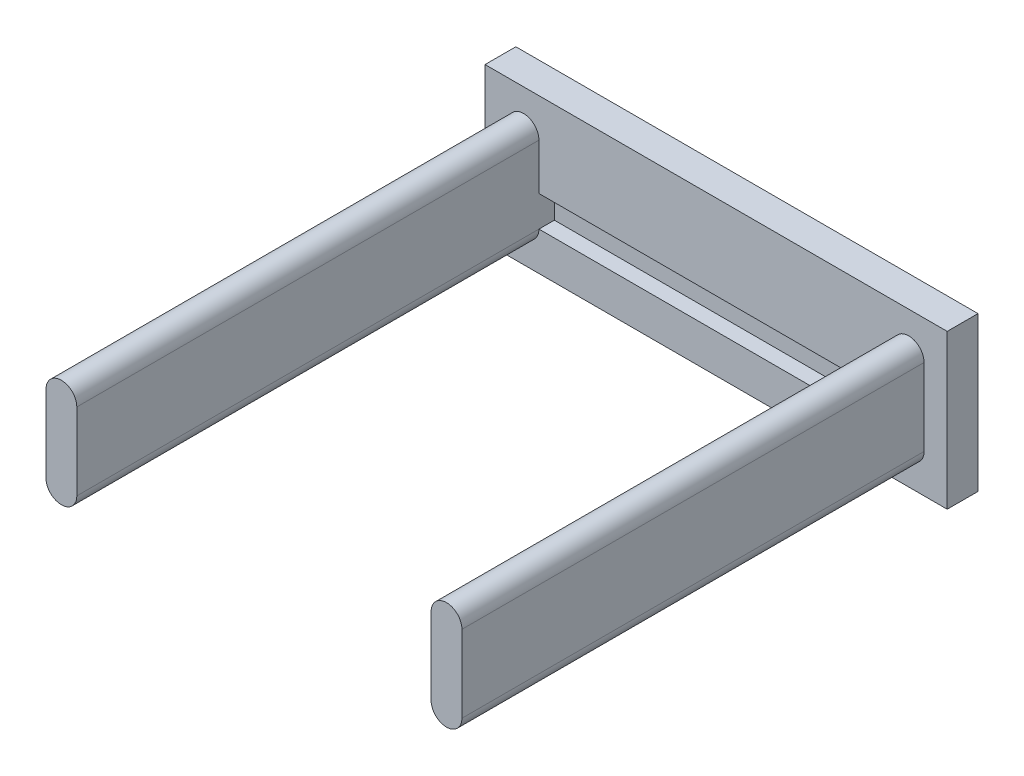
ISO-10303-21;
HEADER;
FILE_DESCRIPTION(('STEP AP214'),'2;1');
FILE_NAME('part.step','',(''),(''),'','','');
FILE_SCHEMA(('AUTOMOTIVE_DESIGN { 1 0 10303 214 1 1 1 1 }'));
ENDSEC;
DATA;
#1=APPLICATION_CONTEXT('core data for automotive mechanical design processes');
#2=APPLICATION_PROTOCOL_DEFINITION('international standard','automotive_design',2000,#1);
#3=PRODUCT_CONTEXT('',#1,'mechanical');
#4=PRODUCT('Part','Part','',(#3));
#5=PRODUCT_RELATED_PRODUCT_CATEGORY('part','',(#4));
#6=PRODUCT_DEFINITION_FORMATION('','',#4);
#7=PRODUCT_DEFINITION_CONTEXT('part definition',#1,'design');
#8=PRODUCT_DEFINITION('design','',#6,#7);
#9=PRODUCT_DEFINITION_SHAPE('','',#8);
#10=(LENGTH_UNIT() NAMED_UNIT(*) SI_UNIT(.MILLI.,.METRE.));
#11=(NAMED_UNIT(*) PLANE_ANGLE_UNIT() SI_UNIT($,.RADIAN.));
#12=(NAMED_UNIT(*) SI_UNIT($,.STERADIAN.) SOLID_ANGLE_UNIT());
#13=UNCERTAINTY_MEASURE_WITH_UNIT(LENGTH_MEASURE(1.E-05),#10,'distance_accuracy_value','');
#14=(GEOMETRIC_REPRESENTATION_CONTEXT(3) GLOBAL_UNCERTAINTY_ASSIGNED_CONTEXT((#13)) GLOBAL_UNIT_ASSIGNED_CONTEXT((#10,
#11,#12)) REPRESENTATION_CONTEXT('',''));
#15=CARTESIAN_POINT('',(0.,0.,0.));
#16=DIRECTION('',(0.,0.,1.));
#17=DIRECTION('',(1.,0.,0.));
#18=AXIS2_PLACEMENT_3D('',#15,#16,#17);
#19=CARTESIAN_POINT('',(0.,0.,2.));
#20=DIRECTION('',(0.,0.,1.));
#21=DIRECTION('',(1.,0.,0.));
#22=AXIS2_PLACEMENT_3D('',#19,#20,#21);
#23=PLANE('',#22);
#24=DIRECTION('',(-1.,0.,0.));
#25=VECTOR('',#24,1.);
#26=CARTESIAN_POINT('',(11.5,-0.5,2.));
#27=LINE('',#26,#25);
#28=CARTESIAN_POINT('',(11.5,-0.5,2.));
#29=VERTEX_POINT('',#28);
#30=CARTESIAN_POINT('',(-11.5,-0.5,2.));
#31=VERTEX_POINT('',#30);
#32=EDGE_CURVE('E190',#29,#31,#27,.T.);
#33=ORIENTED_EDGE('',*,*,#32,.F.);
#34=DIRECTION('',(0.,-1.,0.));
#35=VECTOR('',#34,1.);
#36=CARTESIAN_POINT('',(11.5,0.,2.));
#37=LINE('',#36,#35);
#38=CARTESIAN_POINT('',(11.5,2.5,2.));
#39=VERTEX_POINT('',#38);
#40=EDGE_CURVE('E205',#39,#29,#37,.T.);
#41=ORIENTED_EDGE('',*,*,#40,.F.);
#42=CARTESIAN_POINT('',(12.5,2.5,2.));
#43=DIRECTION('',(0.,0.,1.));
#44=DIRECTION('',(1.,0.,0.));
#45=AXIS2_PLACEMENT_3D('',#42,#43,#44);
#46=CIRCLE('',#45,1.);
#47=CARTESIAN_POINT('',(13.5,2.5,2.));
#48=VERTEX_POINT('',#47);
#49=EDGE_CURVE('E216',#48,#39,#46,.T.);
#50=ORIENTED_EDGE('',*,*,#49,.F.);
#51=DIRECTION('',(0.,-1.,0.));
#52=VECTOR('',#51,1.);
#53=CARTESIAN_POINT('',(13.5,0.,2.));
#54=LINE('',#53,#52);
#55=CARTESIAN_POINT('',(13.5,-2.5,2.));
#56=VERTEX_POINT('',#55);
#57=EDGE_CURVE('E54',#48,#56,#54,.T.);
#58=ORIENTED_EDGE('',*,*,#57,.T.);
#59=CARTESIAN_POINT('',(12.5,-2.5,2.));
#60=DIRECTION('',(0.,0.,1.));
#61=DIRECTION('',(1.,0.,0.));
#62=AXIS2_PLACEMENT_3D('',#59,#60,#61);
#63=CIRCLE('',#62,1.);
#64=CARTESIAN_POINT('',(11.5,-2.5,2.));
#65=VERTEX_POINT('',#64);
#66=EDGE_CURVE('E152',#65,#56,#63,.T.);
#67=ORIENTED_EDGE('',*,*,#66,.F.);
#68=DIRECTION('',(1.,0.,0.));
#69=VECTOR('',#68,1.);
#70=CARTESIAN_POINT('',(-11.5,-2.5,2.));
#71=LINE('',#70,#69);
#72=CARTESIAN_POINT('',(-11.5,-2.5,2.));
#73=VERTEX_POINT('',#72);
#74=EDGE_CURVE('E185',#73,#65,#71,.T.);
#75=ORIENTED_EDGE('',*,*,#74,.F.);
#76=CARTESIAN_POINT('',(-12.5,-2.5,2.));
#77=DIRECTION('',(0.,0.,1.));
#78=DIRECTION('',(1.,0.,0.));
#79=AXIS2_PLACEMENT_3D('',#76,#77,#78);
#80=CIRCLE('',#79,1.);
#81=CARTESIAN_POINT('',(-13.5,-2.5,2.));
#82=VERTEX_POINT('',#81);
#83=EDGE_CURVE('E226',#82,#73,#80,.T.);
#84=ORIENTED_EDGE('',*,*,#83,.F.);
#85=DIRECTION('',(0.,1.,0.));
#86=VECTOR('',#85,1.);
#87=CARTESIAN_POINT('',(-13.5,0.,2.));
#88=LINE('',#87,#86);
#89=CARTESIAN_POINT('',(-13.5,2.5,2.));
#90=VERTEX_POINT('',#89);
#91=EDGE_CURVE('E223',#82,#90,#88,.T.);
#92=ORIENTED_EDGE('',*,*,#91,.T.);
#93=CARTESIAN_POINT('',(-12.5,2.5,2.));
#94=DIRECTION('',(0.,0.,1.));
#95=DIRECTION('',(1.,0.,0.));
#96=AXIS2_PLACEMENT_3D('',#93,#94,#95);
#97=CIRCLE('',#96,0.999999999999999);
#98=CARTESIAN_POINT('',(-11.5,2.5,2.));
#99=VERTEX_POINT('',#98);
#100=EDGE_CURVE('E230',#99,#90,#97,.T.);
#101=ORIENTED_EDGE('',*,*,#100,.F.);
#102=DIRECTION('',(0.,1.,0.));
#103=VECTOR('',#102,1.);
#104=CARTESIAN_POINT('',(-11.5,0.,2.));
#105=LINE('',#104,#103);
#106=EDGE_CURVE('E62',#31,#99,#105,.T.);
#107=ORIENTED_EDGE('',*,*,#106,.F.);
#108=EDGE_LOOP('',(#33,#41,#50,#58,#67,#75,#84,#92,#101,#107));
#109=FACE_BOUND('',#108,.T.);
#110=DIRECTION('',(0.,1.,0.));
#111=VECTOR('',#110,1.);
#112=CARTESIAN_POINT('',(15.,5.,2.));
#113=LINE('',#112,#111);
#114=CARTESIAN_POINT('',(15.,-5.,2.));
#115=VERTEX_POINT('',#114);
#116=CARTESIAN_POINT('',(15.,5.,2.));
#117=VERTEX_POINT('',#116);
#118=EDGE_CURVE('E243',#115,#117,#113,.T.);
#119=ORIENTED_EDGE('',*,*,#118,.T.);
#120=DIRECTION('',(-1.,0.,0.));
#121=VECTOR('',#120,1.);
#122=CARTESIAN_POINT('',(-15.,5.,2.));
#123=LINE('',#122,#121);
#124=CARTESIAN_POINT('',(-15.,5.,2.));
#125=VERTEX_POINT('',#124);
#126=EDGE_CURVE('E246',#117,#125,#123,.T.);
#127=ORIENTED_EDGE('',*,*,#126,.T.);
#128=DIRECTION('',(0.,-1.,0.));
#129=VECTOR('',#128,1.);
#130=CARTESIAN_POINT('',(-15.,5.,2.));
#131=LINE('',#130,#129);
#132=CARTESIAN_POINT('',(-15.,-5.,2.));
#133=VERTEX_POINT('',#132);
#134=EDGE_CURVE('E249',#125,#133,#131,.T.);
#135=ORIENTED_EDGE('',*,*,#134,.T.);
#136=DIRECTION('',(1.,0.,0.));
#137=VECTOR('',#136,1.);
#138=CARTESIAN_POINT('',(-15.,-5.,2.));
#139=LINE('',#138,#137);
#140=EDGE_CURVE('E251',#133,#115,#139,.T.);
#141=ORIENTED_EDGE('',*,*,#140,.T.);
#142=EDGE_LOOP('',(#119,#127,#135,#141));
#143=FACE_BOUND('',#142,.T.);
#144=ADVANCED_FACE('F39',(#109,#143),#23,.T.);
#145=CARTESIAN_POINT('',(15.,5.,2.));
#146=DIRECTION('',(-1.,0.,0.));
#147=DIRECTION('',(0.,-1.,0.));
#148=AXIS2_PLACEMENT_3D('',#145,#146,#147);
#149=PLANE('',#148);
#150=DIRECTION('',(0.,1.,0.));
#151=VECTOR('',#150,1.);
#152=CARTESIAN_POINT('',(15.,5.,0.));
#153=LINE('',#152,#151);
#154=CARTESIAN_POINT('',(15.,-5.,0.));
#155=VERTEX_POINT('',#154);
#156=CARTESIAN_POINT('',(15.,5.,0.));
#157=VERTEX_POINT('',#156);
#158=EDGE_CURVE('E242',#155,#157,#153,.T.);
#159=ORIENTED_EDGE('',*,*,#158,.T.);
#160=DIRECTION('',(0.,0.,-1.));
#161=VECTOR('',#160,1.);
#162=CARTESIAN_POINT('',(15.,5.,2.));
#163=LINE('',#162,#161);
#164=EDGE_CURVE('E11',#117,#157,#163,.T.);
#165=ORIENTED_EDGE('',*,*,#164,.F.);
#166=ORIENTED_EDGE('',*,*,#118,.F.);
#167=DIRECTION('',(0.,0.,-1.));
#168=VECTOR('',#167,1.);
#169=CARTESIAN_POINT('',(15.,-5.,2.));
#170=LINE('',#169,#168);
#171=EDGE_CURVE('E253',#115,#155,#170,.T.);
#172=ORIENTED_EDGE('',*,*,#171,.T.);
#173=EDGE_LOOP('',(#159,#165,#166,#172));
#174=FACE_BOUND('',#173,.T.);
#175=ADVANCED_FACE('F41',(#174),#149,.F.);
#176=CARTESIAN_POINT('',(-15.,5.,2.));
#177=DIRECTION('',(0.,-1.,0.));
#178=DIRECTION('',(0.,0.,-1.));
#179=AXIS2_PLACEMENT_3D('',#176,#177,#178);
#180=PLANE('',#179);
#181=DIRECTION('',(-1.,0.,0.));
#182=VECTOR('',#181,1.);
#183=CARTESIAN_POINT('',(-15.,5.,0.));
#184=LINE('',#183,#182);
#185=CARTESIAN_POINT('',(-15.,5.,0.));
#186=VERTEX_POINT('',#185);
#187=EDGE_CURVE('E256',#157,#186,#184,.T.);
#188=ORIENTED_EDGE('',*,*,#187,.T.);
#189=DIRECTION('',(0.,0.,-1.));
#190=VECTOR('',#189,1.);
#191=CARTESIAN_POINT('',(-15.,5.,2.));
#192=LINE('',#191,#190);
#193=EDGE_CURVE('E47',#125,#186,#192,.T.);
#194=ORIENTED_EDGE('',*,*,#193,.F.);
#195=ORIENTED_EDGE('',*,*,#126,.F.);
#196=ORIENTED_EDGE('',*,*,#164,.T.);
#197=EDGE_LOOP('',(#188,#194,#195,#196));
#198=FACE_BOUND('',#197,.T.);
#199=ADVANCED_FACE('F285',(#198),#180,.F.);
#200=CARTESIAN_POINT('',(-15.,5.,2.));
#201=DIRECTION('',(1.,0.,0.));
#202=DIRECTION('',(0.,1.,0.));
#203=AXIS2_PLACEMENT_3D('',#200,#201,#202);
#204=PLANE('',#203);
#205=DIRECTION('',(0.,-1.,0.));
#206=VECTOR('',#205,1.);
#207=CARTESIAN_POINT('',(-15.,5.,0.));
#208=LINE('',#207,#206);
#209=CARTESIAN_POINT('',(-15.,-5.,0.));
#210=VERTEX_POINT('',#209);
#211=EDGE_CURVE('E258',#186,#210,#208,.T.);
#212=ORIENTED_EDGE('',*,*,#211,.T.);
#213=DIRECTION('',(0.,0.,-1.));
#214=VECTOR('',#213,1.);
#215=CARTESIAN_POINT('',(-15.,-5.,2.));
#216=LINE('',#215,#214);
#217=EDGE_CURVE('E263',#133,#210,#216,.T.);
#218=ORIENTED_EDGE('',*,*,#217,.F.);
#219=ORIENTED_EDGE('',*,*,#134,.F.);
#220=ORIENTED_EDGE('',*,*,#193,.T.);
#221=EDGE_LOOP('',(#212,#218,#219,#220));
#222=FACE_BOUND('',#221,.T.);
#223=ADVANCED_FACE('F270',(#222),#204,.F.);
#224=CARTESIAN_POINT('',(-15.,-5.,2.));
#225=DIRECTION('',(0.,1.,0.));
#226=DIRECTION('',(0.,0.,1.));
#227=AXIS2_PLACEMENT_3D('',#224,#225,#226);
#228=PLANE('',#227);
#229=DIRECTION('',(1.,0.,0.));
#230=VECTOR('',#229,1.);
#231=CARTESIAN_POINT('',(-15.,-5.,0.));
#232=LINE('',#231,#230);
#233=EDGE_CURVE('E247',#210,#155,#232,.T.);
#234=ORIENTED_EDGE('',*,*,#233,.T.);
#235=ORIENTED_EDGE('',*,*,#171,.F.);
#236=ORIENTED_EDGE('',*,*,#140,.F.);
#237=ORIENTED_EDGE('',*,*,#217,.T.);
#238=EDGE_LOOP('',(#234,#235,#236,#237));
#239=FACE_BOUND('',#238,.T.);
#240=ADVANCED_FACE('F279',(#239),#228,.F.);
#241=CARTESIAN_POINT('',(0.,0.,0.));
#242=DIRECTION('',(0.,0.,1.));
#243=DIRECTION('',(1.,0.,0.));
#244=AXIS2_PLACEMENT_3D('',#241,#242,#243);
#245=PLANE('',#244);
#246=ORIENTED_EDGE('',*,*,#158,.F.);
#247=ORIENTED_EDGE('',*,*,#233,.F.);
#248=ORIENTED_EDGE('',*,*,#211,.F.);
#249=ORIENTED_EDGE('',*,*,#187,.F.);
#250=EDGE_LOOP('',(#246,#247,#248,#249));
#251=FACE_BOUND('',#250,.T.);
#252=ADVANCED_FACE('F276',(#251),#245,.F.);
#253=CARTESIAN_POINT('',(-13.5,0.,22.));
#254=DIRECTION('',(-1.,0.,0.));
#255=DIRECTION('',(0.,0.,1.));
#256=AXIS2_PLACEMENT_3D('',#253,#254,#255);
#257=PLANE('',#256);
#258=ORIENTED_EDGE('',*,*,#91,.F.);
#259=DIRECTION('',(0.,0.,-1.));
#260=VECTOR('',#259,1.);
#261=CARTESIAN_POINT('',(-13.5,-2.5,22.));
#262=LINE('',#261,#260);
#263=CARTESIAN_POINT('',(-13.5,-2.5,32.));
#264=VERTEX_POINT('',#263);
#265=EDGE_CURVE('E240',#264,#82,#262,.T.);
#266=ORIENTED_EDGE('',*,*,#265,.F.);
#267=DIRECTION('',(0.,-1.,0.));
#268=VECTOR('',#267,1.);
#269=CARTESIAN_POINT('',(-13.5,0.,32.));
#270=LINE('',#269,#268);
#271=CARTESIAN_POINT('',(-13.5,2.5,32.));
#272=VERTEX_POINT('',#271);
#273=EDGE_CURVE('E176',#272,#264,#270,.T.);
#274=ORIENTED_EDGE('',*,*,#273,.F.);
#275=DIRECTION('',(0.,0.,-1.));
#276=VECTOR('',#275,1.);
#277=CARTESIAN_POINT('',(-13.5,2.5,22.));
#278=LINE('',#277,#276);
#279=EDGE_CURVE('E233',#272,#90,#278,.T.);
#280=ORIENTED_EDGE('',*,*,#279,.T.);
#281=EDGE_LOOP('',(#258,#266,#274,#280));
#282=FACE_BOUND('',#281,.T.);
#283=ADVANCED_FACE('F300',(#282),#257,.T.);
#284=CARTESIAN_POINT('',(-12.5,-2.5,22.));
#285=DIRECTION('',(0.,0.,-1.));
#286=DIRECTION('',(-1.,0.,0.));
#287=AXIS2_PLACEMENT_3D('',#284,#285,#286);
#288=CYLINDRICAL_SURFACE('',#287,1.);
#289=ORIENTED_EDGE('',*,*,#83,.T.);
#290=DIRECTION('',(0.,0.,-1.));
#291=VECTOR('',#290,1.);
#292=CARTESIAN_POINT('',(-11.5,-2.5,22.));
#293=LINE('',#292,#291);
#294=CARTESIAN_POINT('',(-11.5,-2.5,32.));
#295=VERTEX_POINT('',#294);
#296=EDGE_CURVE('E237',#295,#73,#293,.T.);
#297=ORIENTED_EDGE('',*,*,#296,.F.);
#298=CARTESIAN_POINT('',(-12.5,-2.5,32.));
#299=DIRECTION('',(0.,0.,1.));
#300=DIRECTION('',(1.,0.,0.));
#301=AXIS2_PLACEMENT_3D('',#298,#299,#300);
#302=CIRCLE('',#301,1.);
#303=EDGE_CURVE('E179',#264,#295,#302,.T.);
#304=ORIENTED_EDGE('',*,*,#303,.F.);
#305=ORIENTED_EDGE('',*,*,#265,.T.);
#306=EDGE_LOOP('',(#289,#297,#304,#305));
#307=FACE_BOUND('',#306,.T.);
#308=ADVANCED_FACE('F345',(#307),#288,.T.);
#309=CARTESIAN_POINT('',(-11.5,0.,22.));
#310=DIRECTION('',(-1.,0.,0.));
#311=DIRECTION('',(0.,-1.,0.));
#312=AXIS2_PLACEMENT_3D('',#309,#310,#311);
#313=PLANE('',#312);
#314=ORIENTED_EDGE('',*,*,#296,.T.);
#315=DIRECTION('',(0.,0.,1.));
#316=VECTOR('',#315,1.);
#317=CARTESIAN_POINT('',(-11.5,-2.5,1.));
#318=LINE('',#317,#316);
#319=CARTESIAN_POINT('',(-11.5,-2.5,1.));
#320=VERTEX_POINT('',#319);
#321=EDGE_CURVE('E199',#320,#73,#318,.T.);
#322=ORIENTED_EDGE('',*,*,#321,.F.);
#323=DIRECTION('',(0.,-1.,0.));
#324=VECTOR('',#323,1.);
#325=CARTESIAN_POINT('',(-11.5,-0.5,1.));
#326=LINE('',#325,#324);
#327=CARTESIAN_POINT('',(-11.5,-0.5,1.));
#328=VERTEX_POINT('',#327);
#329=EDGE_CURVE('E186',#328,#320,#326,.T.);
#330=ORIENTED_EDGE('',*,*,#329,.F.);
#331=DIRECTION('',(0.,0.,1.));
#332=VECTOR('',#331,1.);
#333=CARTESIAN_POINT('',(-11.5,-0.5,1.));
#334=LINE('',#333,#332);
#335=EDGE_CURVE('E203',#328,#31,#334,.T.);
#336=ORIENTED_EDGE('',*,*,#335,.T.);
#337=ORIENTED_EDGE('',*,*,#106,.T.);
#338=DIRECTION('',(0.,0.,-1.));
#339=VECTOR('',#338,1.);
#340=CARTESIAN_POINT('',(-11.5,2.5,22.));
#341=LINE('',#340,#339);
#342=CARTESIAN_POINT('',(-11.5,2.5,32.));
#343=VERTEX_POINT('',#342);
#344=EDGE_CURVE('E235',#343,#99,#341,.T.);
#345=ORIENTED_EDGE('',*,*,#344,.F.);
#346=DIRECTION('',(0.,1.,0.));
#347=VECTOR('',#346,1.);
#348=CARTESIAN_POINT('',(-11.5,0.,32.));
#349=LINE('',#348,#347);
#350=EDGE_CURVE('E182',#295,#343,#349,.T.);
#351=ORIENTED_EDGE('',*,*,#350,.F.);
#352=EDGE_LOOP('',(#314,#322,#330,#336,#337,#345,#351));
#353=FACE_BOUND('',#352,.T.);
#354=ADVANCED_FACE('F352',(#353),#313,.F.);
#355=CARTESIAN_POINT('',(-12.5,2.5,22.));
#356=DIRECTION('',(0.,0.,-1.));
#357=DIRECTION('',(-1.,0.,0.));
#358=AXIS2_PLACEMENT_3D('',#355,#356,#357);
#359=CYLINDRICAL_SURFACE('',#358,0.999999999999999);
#360=ORIENTED_EDGE('',*,*,#100,.T.);
#361=ORIENTED_EDGE('',*,*,#279,.F.);
#362=CARTESIAN_POINT('',(-12.5,2.5,32.));
#363=DIRECTION('',(0.,0.,1.));
#364=DIRECTION('',(1.,0.,0.));
#365=AXIS2_PLACEMENT_3D('',#362,#363,#364);
#366=CIRCLE('',#365,0.999999999999999);
#367=EDGE_CURVE('E173',#343,#272,#366,.T.);
#368=ORIENTED_EDGE('',*,*,#367,.F.);
#369=ORIENTED_EDGE('',*,*,#344,.T.);
#370=EDGE_LOOP('',(#360,#361,#368,#369));
#371=FACE_BOUND('',#370,.T.);
#372=ADVANCED_FACE('F359',(#371),#359,.T.);
#373=CARTESIAN_POINT('',(11.5,0.,22.));
#374=DIRECTION('',(1.,0.,0.));
#375=DIRECTION('',(0.,0.,-1.));
#376=AXIS2_PLACEMENT_3D('',#373,#374,#375);
#377=PLANE('',#376);
#378=ORIENTED_EDGE('',*,*,#40,.T.);
#379=DIRECTION('',(0.,0.,1.));
#380=VECTOR('',#379,1.);
#381=CARTESIAN_POINT('',(11.5,-0.5,1.));
#382=LINE('',#381,#380);
#383=CARTESIAN_POINT('',(11.5,-0.5,1.));
#384=VERTEX_POINT('',#383);
#385=EDGE_CURVE('E206',#384,#29,#382,.T.);
#386=ORIENTED_EDGE('',*,*,#385,.F.);
#387=DIRECTION('',(0.,1.,0.));
#388=VECTOR('',#387,1.);
#389=CARTESIAN_POINT('',(11.5,-2.50000000000001,1.));
#390=LINE('',#389,#388);
#391=CARTESIAN_POINT('',(11.5,-2.50000000000001,1.));
#392=VERTEX_POINT('',#391);
#393=EDGE_CURVE('E193',#392,#384,#390,.T.);
#394=ORIENTED_EDGE('',*,*,#393,.F.);
#395=DIRECTION('',(0.,0.,1.));
#396=VECTOR('',#395,1.);
#397=CARTESIAN_POINT('',(11.5,-2.50000000000001,1.));
#398=LINE('',#397,#396);
#399=EDGE_CURVE('E208',#392,#65,#398,.T.);
#400=ORIENTED_EDGE('',*,*,#399,.T.);
#401=DIRECTION('',(0.,0.,-1.));
#402=VECTOR('',#401,1.);
#403=CARTESIAN_POINT('',(11.5,-2.5,22.));
#404=LINE('',#403,#402);
#405=CARTESIAN_POINT('',(11.5,-2.5,32.));
#406=VERTEX_POINT('',#405);
#407=EDGE_CURVE('E154',#406,#65,#404,.T.);
#408=ORIENTED_EDGE('',*,*,#407,.F.);
#409=DIRECTION('',(0.,-1.,0.));
#410=VECTOR('',#409,1.);
#411=CARTESIAN_POINT('',(11.5,0.,32.));
#412=LINE('',#411,#410);
#413=CARTESIAN_POINT('',(11.5,2.5,32.));
#414=VERTEX_POINT('',#413);
#415=EDGE_CURVE('E164',#414,#406,#412,.T.);
#416=ORIENTED_EDGE('',*,*,#415,.F.);
#417=DIRECTION('',(0.,0.,-1.));
#418=VECTOR('',#417,1.);
#419=CARTESIAN_POINT('',(11.5,2.5,22.));
#420=LINE('',#419,#418);
#421=EDGE_CURVE('E218',#414,#39,#420,.T.);
#422=ORIENTED_EDGE('',*,*,#421,.T.);
#423=EDGE_LOOP('',(#378,#386,#394,#400,#408,#416,#422));
#424=FACE_BOUND('',#423,.T.);
#425=ADVANCED_FACE('F366',(#424),#377,.F.);
#426=CARTESIAN_POINT('',(12.5,-2.5,22.));
#427=DIRECTION('',(0.,0.,-1.));
#428=DIRECTION('',(-1.,0.,0.));
#429=AXIS2_PLACEMENT_3D('',#426,#427,#428);
#430=CYLINDRICAL_SURFACE('',#429,1.);
#431=ORIENTED_EDGE('',*,*,#66,.T.);
#432=DIRECTION('',(0.,0.,-1.));
#433=VECTOR('',#432,1.);
#434=CARTESIAN_POINT('',(13.5,-2.5,22.));
#435=LINE('',#434,#433);
#436=CARTESIAN_POINT('',(13.5,-2.5,32.));
#437=VERTEX_POINT('',#436);
#438=EDGE_CURVE('E146',#437,#56,#435,.T.);
#439=ORIENTED_EDGE('',*,*,#438,.F.);
#440=CARTESIAN_POINT('',(12.5,-2.5,32.));
#441=DIRECTION('',(0.,0.,1.));
#442=DIRECTION('',(1.,0.,0.));
#443=AXIS2_PLACEMENT_3D('',#440,#441,#442);
#444=CIRCLE('',#443,1.);
#445=EDGE_CURVE('E150',#406,#437,#444,.T.);
#446=ORIENTED_EDGE('',*,*,#445,.F.);
#447=ORIENTED_EDGE('',*,*,#407,.T.);
#448=EDGE_LOOP('',(#431,#439,#446,#447));
#449=FACE_BOUND('',#448,.T.);
#450=ADVANCED_FACE('F148',(#449),#430,.T.);
#451=CARTESIAN_POINT('',(13.5,0.,22.));
#452=DIRECTION('',(1.,0.,0.));
#453=DIRECTION('',(0.,0.,-1.));
#454=AXIS2_PLACEMENT_3D('',#451,#452,#453);
#455=PLANE('',#454);
#456=ORIENTED_EDGE('',*,*,#57,.F.);
#457=DIRECTION('',(0.,0.,-1.));
#458=VECTOR('',#457,1.);
#459=CARTESIAN_POINT('',(13.5,2.5,22.));
#460=LINE('',#459,#458);
#461=CARTESIAN_POINT('',(13.5,2.5,32.));
#462=VERTEX_POINT('',#461);
#463=EDGE_CURVE('E155',#462,#48,#460,.T.);
#464=ORIENTED_EDGE('',*,*,#463,.F.);
#465=DIRECTION('',(0.,-1.,0.));
#466=VECTOR('',#465,1.);
#467=CARTESIAN_POINT('',(13.5,0.,32.));
#468=LINE('',#467,#466);
#469=EDGE_CURVE('E162',#462,#437,#468,.T.);
#470=ORIENTED_EDGE('',*,*,#469,.T.);
#471=ORIENTED_EDGE('',*,*,#438,.T.);
#472=EDGE_LOOP('',(#456,#464,#470,#471));
#473=FACE_BOUND('',#472,.T.);
#474=ADVANCED_FACE('F166',(#473),#455,.T.);
#475=CARTESIAN_POINT('',(12.5,2.5,22.));
#476=DIRECTION('',(0.,0.,-1.));
#477=DIRECTION('',(-1.,0.,0.));
#478=AXIS2_PLACEMENT_3D('',#475,#476,#477);
#479=CYLINDRICAL_SURFACE('',#478,1.);
#480=ORIENTED_EDGE('',*,*,#49,.T.);
#481=ORIENTED_EDGE('',*,*,#421,.F.);
#482=CARTESIAN_POINT('',(12.5,2.5,32.));
#483=DIRECTION('',(0.,0.,1.));
#484=DIRECTION('',(1.,0.,0.));
#485=AXIS2_PLACEMENT_3D('',#482,#483,#484);
#486=CIRCLE('',#485,1.);
#487=EDGE_CURVE('E168',#462,#414,#486,.T.);
#488=ORIENTED_EDGE('',*,*,#487,.F.);
#489=ORIENTED_EDGE('',*,*,#463,.T.);
#490=EDGE_LOOP('',(#480,#481,#488,#489));
#491=FACE_BOUND('',#490,.T.);
#492=ADVANCED_FACE('F321',(#491),#479,.T.);
#493=CARTESIAN_POINT('',(11.5,-0.5,1.));
#494=DIRECTION('',(0.,1.,0.));
#495=DIRECTION('',(0.,0.,1.));
#496=AXIS2_PLACEMENT_3D('',#493,#494,#495);
#497=PLANE('',#496);
#498=ORIENTED_EDGE('',*,*,#32,.T.);
#499=ORIENTED_EDGE('',*,*,#335,.F.);
#500=DIRECTION('',(-1.,0.,0.));
#501=VECTOR('',#500,1.);
#502=CARTESIAN_POINT('',(11.5,-0.5,1.));
#503=LINE('',#502,#501);
#504=EDGE_CURVE('E196',#384,#328,#503,.T.);
#505=ORIENTED_EDGE('',*,*,#504,.F.);
#506=ORIENTED_EDGE('',*,*,#385,.T.);
#507=EDGE_LOOP('',(#498,#499,#505,#506));
#508=FACE_BOUND('',#507,.T.);
#509=ADVANCED_FACE('F316',(#508),#497,.F.);
#510=CARTESIAN_POINT('',(-11.5,-2.5,1.));
#511=DIRECTION('',(0.,-1.,0.));
#512=DIRECTION('',(1.,0.,0.));
#513=AXIS2_PLACEMENT_3D('',#510,#511,#512);
#514=PLANE('',#513);
#515=ORIENTED_EDGE('',*,*,#74,.T.);
#516=ORIENTED_EDGE('',*,*,#399,.F.);
#517=DIRECTION('',(1.,0.,0.));
#518=VECTOR('',#517,1.);
#519=CARTESIAN_POINT('',(-11.5,-2.5,1.));
#520=LINE('',#519,#518);
#521=EDGE_CURVE('E189',#320,#392,#520,.T.);
#522=ORIENTED_EDGE('',*,*,#521,.F.);
#523=ORIENTED_EDGE('',*,*,#321,.T.);
#524=EDGE_LOOP('',(#515,#516,#522,#523));
#525=FACE_BOUND('',#524,.T.);
#526=ADVANCED_FACE('F320',(#525),#514,.F.);
#527=CARTESIAN_POINT('',(0.,0.,1.));
#528=DIRECTION('',(0.,0.,1.));
#529=DIRECTION('',(1.,0.,0.));
#530=AXIS2_PLACEMENT_3D('',#527,#528,#529);
#531=PLANE('',#530);
#532=ORIENTED_EDGE('',*,*,#329,.T.);
#533=ORIENTED_EDGE('',*,*,#521,.T.);
#534=ORIENTED_EDGE('',*,*,#393,.T.);
#535=ORIENTED_EDGE('',*,*,#504,.T.);
#536=EDGE_LOOP('',(#532,#533,#534,#535));
#537=FACE_BOUND('',#536,.T.);
#538=ADVANCED_FACE('F329',(#537),#531,.T.);
#539=CARTESIAN_POINT('',(0.,0.,32.));
#540=DIRECTION('',(0.,0.,1.));
#541=DIRECTION('',(1.,0.,0.));
#542=AXIS2_PLACEMENT_3D('',#539,#540,#541);
#543=PLANE('',#542);
#544=ORIENTED_EDGE('',*,*,#367,.T.);
#545=ORIENTED_EDGE('',*,*,#273,.T.);
#546=ORIENTED_EDGE('',*,*,#303,.T.);
#547=ORIENTED_EDGE('',*,*,#350,.T.);
#548=EDGE_LOOP('',(#544,#545,#546,#547));
#549=FACE_BOUND('',#548,.T.);
#550=ADVANCED_FACE('F337',(#549),#543,.T.);
#551=CARTESIAN_POINT('',(0.,0.,32.));
#552=DIRECTION('',(0.,0.,1.));
#553=DIRECTION('',(1.,0.,0.));
#554=AXIS2_PLACEMENT_3D('',#551,#552,#553);
#555=PLANE('',#554);
#556=ORIENTED_EDGE('',*,*,#445,.T.);
#557=ORIENTED_EDGE('',*,*,#469,.F.);
#558=ORIENTED_EDGE('',*,*,#487,.T.);
#559=ORIENTED_EDGE('',*,*,#415,.T.);
#560=EDGE_LOOP('',(#556,#557,#558,#559));
#561=FACE_BOUND('',#560,.T.);
#562=ADVANCED_FACE('F160',(#561),#555,.T.);
#563=CLOSED_SHELL('',(#144,#175,#199,#223,#240,#252,#283,#308,#354,#372,#425,#450,#474,#492,
#509,#526,#538,#550,#562));
#564=MANIFOLD_SOLID_BREP('B2',#563);
#565=ADVANCED_BREP_SHAPE_REPRESENTATION('',(#18,#564),#14);
#566=SHAPE_DEFINITION_REPRESENTATION(#9,#565);
ENDSEC;
END-ISO-10303-21;
